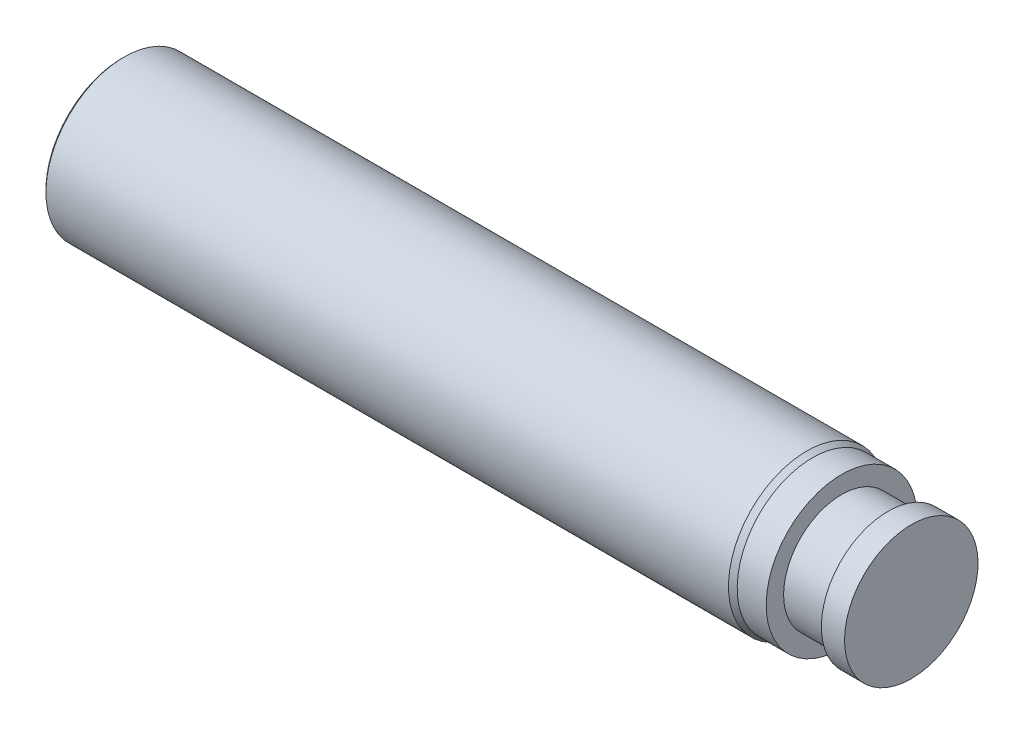
ISO-10303-21;
HEADER;
FILE_DESCRIPTION(('STEP AP214'),'2;1');
FILE_NAME('part.step','',(''),(''),'','','');
FILE_SCHEMA(('AUTOMOTIVE_DESIGN { 1 0 10303 214 1 1 1 1 }'));
ENDSEC;
DATA;
#1=APPLICATION_CONTEXT('core data for automotive mechanical design processes');
#2=APPLICATION_PROTOCOL_DEFINITION('international standard','automotive_design',2000,#1);
#3=PRODUCT_CONTEXT('',#1,'mechanical');
#4=PRODUCT('Part','Part','',(#3));
#5=PRODUCT_RELATED_PRODUCT_CATEGORY('part','',(#4));
#6=PRODUCT_DEFINITION_FORMATION('','',#4);
#7=PRODUCT_DEFINITION_CONTEXT('part definition',#1,'design');
#8=PRODUCT_DEFINITION('design','',#6,#7);
#9=PRODUCT_DEFINITION_SHAPE('','',#8);
#10=(LENGTH_UNIT() NAMED_UNIT(*) SI_UNIT(.MILLI.,.METRE.));
#11=(NAMED_UNIT(*) PLANE_ANGLE_UNIT() SI_UNIT($,.RADIAN.));
#12=(NAMED_UNIT(*) SI_UNIT($,.STERADIAN.) SOLID_ANGLE_UNIT());
#13=UNCERTAINTY_MEASURE_WITH_UNIT(LENGTH_MEASURE(1.E-05),#10,'distance_accuracy_value','');
#14=(GEOMETRIC_REPRESENTATION_CONTEXT(3) GLOBAL_UNCERTAINTY_ASSIGNED_CONTEXT((#13)) GLOBAL_UNIT_ASSIGNED_CONTEXT((#10,
#11,#12)) REPRESENTATION_CONTEXT('',''));
#15=CARTESIAN_POINT('',(0.,0.,0.));
#16=DIRECTION('',(0.,0.,1.));
#17=DIRECTION('',(1.,0.,0.));
#18=AXIS2_PLACEMENT_3D('',#15,#16,#17);
#19=CARTESIAN_POINT('',(730.,57.5,0.));
#20=DIRECTION('',(-1.,0.,0.));
#21=DIRECTION('',(0.,-1.,0.));
#22=AXIS2_PLACEMENT_3D('',#19,#20,#21);
#23=PLANE('',#22);
#24=CARTESIAN_POINT('',(730.,0.,0.));
#25=DIRECTION('',(-1.,0.,0.));
#26=DIRECTION('',(0.,-1.,0.));
#27=AXIS2_PLACEMENT_3D('',#24,#25,#26);
#28=CIRCLE('',#27,57.5);
#29=CARTESIAN_POINT('',(730.,-57.5,0.));
#30=VERTEX_POINT('',#29);
#31=EDGE_CURVE('E18',#30,#30,#28,.T.);
#32=ORIENTED_EDGE('',*,*,#31,.F.);
#33=EDGE_LOOP('',(#32));
#34=FACE_BOUND('',#33,.T.);
#35=ADVANCED_FACE('F15',(#34),#23,.F.);
#36=CARTESIAN_POINT('',(0.,0.,0.));
#37=DIRECTION('',(-1.,0.,0.));
#38=DIRECTION('',(0.,-1.,0.));
#39=AXIS2_PLACEMENT_3D('',#36,#37,#38);
#40=CYLINDRICAL_SURFACE('',#39,57.5);
#41=CARTESIAN_POINT('',(710.,0.,0.));
#42=DIRECTION('',(-1.,0.,0.));
#43=DIRECTION('',(0.,-1.,0.));
#44=AXIS2_PLACEMENT_3D('',#41,#42,#43);
#45=CIRCLE('',#44,57.5);
#46=CARTESIAN_POINT('',(710.,-57.5,0.));
#47=VERTEX_POINT('',#46);
#48=EDGE_CURVE('E43',#47,#47,#45,.F.);
#49=ORIENTED_EDGE('',*,*,#48,.T.);
#50=EDGE_LOOP('',(#49));
#51=FACE_BOUND('',#50,.T.);
#52=ORIENTED_EDGE('',*,*,#31,.T.);
#53=EDGE_LOOP('',(#52));
#54=FACE_BOUND('',#53,.T.);
#55=ADVANCED_FACE('F50',(#51,#54),#40,.T.);
#56=CARTESIAN_POINT('',(710.,50.,0.));
#57=DIRECTION('',(1.,0.,0.));
#58=DIRECTION('',(0.,1.,0.));
#59=AXIS2_PLACEMENT_3D('',#56,#57,#58);
#60=PLANE('',#59);
#61=ORIENTED_EDGE('',*,*,#48,.F.);
#62=EDGE_LOOP('',(#61));
#63=FACE_BOUND('',#62,.T.);
#64=CARTESIAN_POINT('',(710.,0.,0.));
#65=DIRECTION('',(-1.,0.,0.));
#66=DIRECTION('',(0.,-1.,0.));
#67=AXIS2_PLACEMENT_3D('',#64,#65,#66);
#68=CIRCLE('',#67,50.);
#69=CARTESIAN_POINT('',(710.,-50.,0.));
#70=VERTEX_POINT('',#69);
#71=EDGE_CURVE('E41',#70,#70,#68,.T.);
#72=ORIENTED_EDGE('',*,*,#71,.F.);
#73=EDGE_LOOP('',(#72));
#74=FACE_BOUND('',#73,.T.);
#75=ADVANCED_FACE('F57',(#63,#74),#60,.F.);
#76=CARTESIAN_POINT('',(0.,0.,0.));
#77=DIRECTION('',(-1.,0.,0.));
#78=DIRECTION('',(0.,-1.,0.));
#79=AXIS2_PLACEMENT_3D('',#76,#77,#78);
#80=CYLINDRICAL_SURFACE('',#79,50.);
#81=CARTESIAN_POINT('',(670.,0.,0.));
#82=DIRECTION('',(-1.,0.,0.));
#83=DIRECTION('',(0.,-1.,0.));
#84=AXIS2_PLACEMENT_3D('',#81,#82,#83);
#85=CIRCLE('',#84,50.);
#86=CARTESIAN_POINT('',(670.,-50.,0.));
#87=VERTEX_POINT('',#86);
#88=EDGE_CURVE('E38',#87,#87,#85,.F.);
#89=ORIENTED_EDGE('',*,*,#88,.T.);
#90=EDGE_LOOP('',(#89));
#91=FACE_BOUND('',#90,.T.);
#92=ORIENTED_EDGE('',*,*,#71,.T.);
#93=EDGE_LOOP('',(#92));
#94=FACE_BOUND('',#93,.T.);
#95=ADVANCED_FACE('F84',(#91,#94),#80,.T.);
#96=CARTESIAN_POINT('',(670.,65.,0.));
#97=DIRECTION('',(-1.,0.,0.));
#98=DIRECTION('',(0.,-1.,0.));
#99=AXIS2_PLACEMENT_3D('',#96,#97,#98);
#100=PLANE('',#99);
#101=ORIENTED_EDGE('',*,*,#88,.F.);
#102=EDGE_LOOP('',(#101));
#103=FACE_BOUND('',#102,.T.);
#104=CARTESIAN_POINT('',(670.,0.,0.));
#105=DIRECTION('',(-1.,0.,0.));
#106=DIRECTION('',(0.,-1.,0.));
#107=AXIS2_PLACEMENT_3D('',#104,#105,#106);
#108=CIRCLE('',#107,65.);
#109=CARTESIAN_POINT('',(670.,-65.,0.));
#110=VERTEX_POINT('',#109);
#111=EDGE_CURVE('E33',#110,#110,#108,.T.);
#112=ORIENTED_EDGE('',*,*,#111,.F.);
#113=EDGE_LOOP('',(#112));
#114=FACE_BOUND('',#113,.T.);
#115=ADVANCED_FACE('F80',(#103,#114),#100,.F.);
#116=CARTESIAN_POINT('',(0.,0.,0.));
#117=DIRECTION('',(-1.,0.,0.));
#118=DIRECTION('',(0.,-1.,0.));
#119=AXIS2_PLACEMENT_3D('',#116,#117,#118);
#120=CYLINDRICAL_SURFACE('',#119,65.);
#121=CARTESIAN_POINT('',(645.,0.,0.));
#122=DIRECTION('',(-1.,0.,0.));
#123=DIRECTION('',(0.,-1.,0.));
#124=AXIS2_PLACEMENT_3D('',#121,#122,#123);
#125=CIRCLE('',#124,65.);
#126=CARTESIAN_POINT('',(645.,-65.,0.));
#127=VERTEX_POINT('',#126);
#128=EDGE_CURVE('E30',#127,#127,#125,.T.);
#129=ORIENTED_EDGE('',*,*,#128,.F.);
#130=EDGE_LOOP('',(#129));
#131=FACE_BOUND('',#130,.T.);
#132=ORIENTED_EDGE('',*,*,#111,.T.);
#133=EDGE_LOOP('',(#132));
#134=FACE_BOUND('',#133,.T.);
#135=ADVANCED_FACE('F76',(#131,#134),#120,.T.);
#136=CARTESIAN_POINT('',(50.,0.,0.));
#137=DIRECTION('',(1.,0.,0.));
#138=DIRECTION('',(0.,1.,0.));
#139=AXIS2_PLACEMENT_3D('',#136,#137,#138);
#140=PLANE('',#139);
#141=CARTESIAN_POINT('',(50.,0.,0.));
#142=DIRECTION('',(1.,0.,0.));
#143=DIRECTION('',(0.,0.,-1.));
#144=AXIS2_PLACEMENT_3D('',#141,#142,#143);
#145=CIRCLE('',#144,65.5000000000001);
#146=CARTESIAN_POINT('',(50.,0.,-65.5000000000001));
#147=VERTEX_POINT('',#146);
#148=EDGE_CURVE('E27',#147,#147,#145,.T.);
#149=ORIENTED_EDGE('',*,*,#148,.F.);
#150=EDGE_LOOP('',(#149));
#151=FACE_BOUND('',#150,.T.);
#152=ADVANCED_FACE('F72',(#151),#140,.F.);
#153=CARTESIAN_POINT('',(640.,0.,0.));
#154=DIRECTION('',(-1.,0.,0.));
#155=DIRECTION('',(0.,0.,1.));
#156=AXIS2_PLACEMENT_3D('',#153,#154,#155);
#157=CONICAL_SURFACE('',#156,67.5,0.463647609000806);
#158=CARTESIAN_POINT('',(640.,0.,0.));
#159=DIRECTION('',(-1.,0.,0.));
#160=DIRECTION('',(0.,-1.,0.));
#161=AXIS2_PLACEMENT_3D('',#158,#159,#160);
#162=CIRCLE('',#161,67.5);
#163=CARTESIAN_POINT('',(640.,-67.5,0.));
#164=VERTEX_POINT('',#163);
#165=EDGE_CURVE('E22',#164,#164,#162,.T.);
#166=ORIENTED_EDGE('',*,*,#165,.F.);
#167=EDGE_LOOP('',(#166));
#168=FACE_BOUND('',#167,.T.);
#169=ORIENTED_EDGE('',*,*,#128,.T.);
#170=EDGE_LOOP('',(#169));
#171=FACE_BOUND('',#170,.T.);
#172=ADVANCED_FACE('F65',(#168,#171),#157,.T.);
#173=CARTESIAN_POINT('',(52.,0.,0.));
#174=DIRECTION('',(1.,0.,0.));
#175=DIRECTION('',(0.,0.,-1.));
#176=AXIS2_PLACEMENT_3D('',#173,#174,#175);
#177=CONICAL_SURFACE('',#176,67.5,0.785398163397441);
#178=CARTESIAN_POINT('',(52.,0.,0.));
#179=DIRECTION('',(-1.,0.,0.));
#180=DIRECTION('',(0.,-1.,0.));
#181=AXIS2_PLACEMENT_3D('',#178,#179,#180);
#182=CIRCLE('',#181,67.5);
#183=CARTESIAN_POINT('',(52.,-67.5,0.));
#184=VERTEX_POINT('',#183);
#185=EDGE_CURVE('E10',#184,#184,#182,.F.);
#186=ORIENTED_EDGE('',*,*,#185,.F.);
#187=EDGE_LOOP('',(#186));
#188=FACE_BOUND('',#187,.T.);
#189=ORIENTED_EDGE('',*,*,#148,.T.);
#190=EDGE_LOOP('',(#189));
#191=FACE_BOUND('',#190,.T.);
#192=ADVANCED_FACE('F60',(#188,#191),#177,.T.);
#193=CARTESIAN_POINT('',(0.,0.,0.));
#194=DIRECTION('',(-1.,0.,0.));
#195=DIRECTION('',(0.,-1.,0.));
#196=AXIS2_PLACEMENT_3D('',#193,#194,#195);
#197=CYLINDRICAL_SURFACE('',#196,67.5);
#198=ORIENTED_EDGE('',*,*,#185,.T.);
#199=EDGE_LOOP('',(#198));
#200=FACE_BOUND('',#199,.T.);
#201=ORIENTED_EDGE('',*,*,#165,.T.);
#202=EDGE_LOOP('',(#201));
#203=FACE_BOUND('',#202,.T.);
#204=ADVANCED_FACE('F58',(#200,#203),#197,.T.);
#205=CLOSED_SHELL('',(#35,#55,#75,#95,#115,#135,#152,#172,#192,#204));
#206=MANIFOLD_SOLID_BREP('B1',#205);
#207=ADVANCED_BREP_SHAPE_REPRESENTATION('',(#18,#206),#14);
#208=SHAPE_DEFINITION_REPRESENTATION(#9,#207);
ENDSEC;
END-ISO-10303-21;
